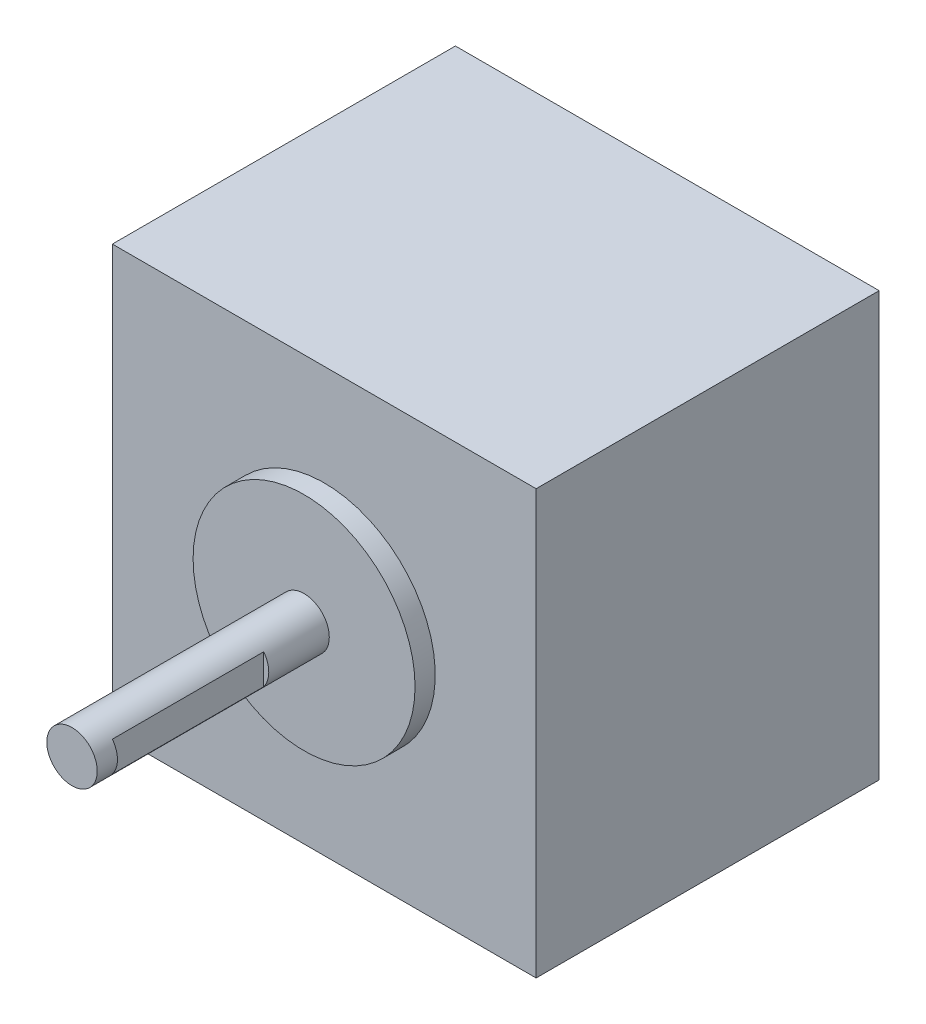
ISO-10303-21;
HEADER;
FILE_DESCRIPTION(('STEP AP214'),'2;1');
FILE_NAME('part.step','',(''),(''),'','','');
FILE_SCHEMA(('AUTOMOTIVE_DESIGN { 1 0 10303 214 1 1 1 1 }'));
ENDSEC;
DATA;
#1=APPLICATION_CONTEXT('core data for automotive mechanical design processes');
#2=APPLICATION_PROTOCOL_DEFINITION('international standard','automotive_design',2000,#1);
#3=PRODUCT_CONTEXT('',#1,'mechanical');
#4=PRODUCT('Part','Part','',(#3));
#5=PRODUCT_RELATED_PRODUCT_CATEGORY('part','',(#4));
#6=PRODUCT_DEFINITION_FORMATION('','',#4);
#7=PRODUCT_DEFINITION_CONTEXT('part definition',#1,'design');
#8=PRODUCT_DEFINITION('design','',#6,#7);
#9=PRODUCT_DEFINITION_SHAPE('','',#8);
#10=(LENGTH_UNIT() NAMED_UNIT(*) SI_UNIT(.MILLI.,.METRE.));
#11=(NAMED_UNIT(*) PLANE_ANGLE_UNIT() SI_UNIT($,.RADIAN.));
#12=(NAMED_UNIT(*) SI_UNIT($,.STERADIAN.) SOLID_ANGLE_UNIT());
#13=UNCERTAINTY_MEASURE_WITH_UNIT(LENGTH_MEASURE(1.E-05),#10,'distance_accuracy_value','');
#14=(GEOMETRIC_REPRESENTATION_CONTEXT(3) GLOBAL_UNCERTAINTY_ASSIGNED_CONTEXT((#13)) GLOBAL_UNIT_ASSIGNED_CONTEXT((#10,
#11,#12)) REPRESENTATION_CONTEXT('',''));
#15=CARTESIAN_POINT('',(0.,0.,0.));
#16=DIRECTION('',(0.,0.,1.));
#17=DIRECTION('',(1.,0.,0.));
#18=AXIS2_PLACEMENT_3D('',#15,#16,#17);
#19=CARTESIAN_POINT('',(21.,-21.,-34.));
#20=DIRECTION('',(1.,0.,0.));
#21=DIRECTION('',(0.,0.,-1.));
#22=AXIS2_PLACEMENT_3D('',#19,#20,#21);
#23=PLANE('',#22);
#24=DIRECTION('',(0.,1.,0.));
#25=VECTOR('',#24,1.);
#26=CARTESIAN_POINT('',(21.,-21.,0.));
#27=LINE('',#26,#25);
#28=CARTESIAN_POINT('',(21.,-21.,0.));
#29=VERTEX_POINT('',#28);
#30=CARTESIAN_POINT('',(21.,21.,0.));
#31=VERTEX_POINT('',#30);
#32=EDGE_CURVE('E140',#29,#31,#27,.T.);
#33=ORIENTED_EDGE('',*,*,#32,.F.);
#34=DIRECTION('',(0.,0.,1.));
#35=VECTOR('',#34,1.);
#36=CARTESIAN_POINT('',(21.,-21.,-34.));
#37=LINE('',#36,#35);
#38=CARTESIAN_POINT('',(21.,-21.,-34.));
#39=VERTEX_POINT('',#38);
#40=EDGE_CURVE('E62',#39,#29,#37,.T.);
#41=ORIENTED_EDGE('',*,*,#40,.F.);
#42=DIRECTION('',(0.,1.,0.));
#43=VECTOR('',#42,1.);
#44=CARTESIAN_POINT('',(21.,-21.,-34.));
#45=LINE('',#44,#43);
#46=CARTESIAN_POINT('',(21.,21.,-34.));
#47=VERTEX_POINT('',#46);
#48=EDGE_CURVE('E132',#39,#47,#45,.T.);
#49=ORIENTED_EDGE('',*,*,#48,.T.);
#50=DIRECTION('',(0.,0.,1.));
#51=VECTOR('',#50,1.);
#52=CARTESIAN_POINT('',(21.,21.,-34.));
#53=LINE('',#52,#51);
#54=EDGE_CURVE('E90',#47,#31,#53,.T.);
#55=ORIENTED_EDGE('',*,*,#54,.T.);
#56=EDGE_LOOP('',(#33,#41,#49,#55));
#57=FACE_BOUND('',#56,.T.);
#58=ADVANCED_FACE('F39',(#57),#23,.T.);
#59=CARTESIAN_POINT('',(-21.,-21.,-34.));
#60=DIRECTION('',(0.,-1.,0.));
#61=DIRECTION('',(0.,0.,-1.));
#62=AXIS2_PLACEMENT_3D('',#59,#60,#61);
#63=PLANE('',#62);
#64=DIRECTION('',(1.,0.,0.));
#65=VECTOR('',#64,1.);
#66=CARTESIAN_POINT('',(-21.,-21.,0.));
#67=LINE('',#66,#65);
#68=CARTESIAN_POINT('',(-21.,-21.,0.));
#69=VERTEX_POINT('',#68);
#70=EDGE_CURVE('E128',#69,#29,#67,.T.);
#71=ORIENTED_EDGE('',*,*,#70,.F.);
#72=DIRECTION('',(0.,0.,1.));
#73=VECTOR('',#72,1.);
#74=CARTESIAN_POINT('',(-21.,-21.,-34.));
#75=LINE('',#74,#73);
#76=CARTESIAN_POINT('',(-21.,-21.,-34.));
#77=VERTEX_POINT('',#76);
#78=EDGE_CURVE('E130',#77,#69,#75,.T.);
#79=ORIENTED_EDGE('',*,*,#78,.F.);
#80=DIRECTION('',(1.,0.,0.));
#81=VECTOR('',#80,1.);
#82=CARTESIAN_POINT('',(-21.,-21.,-34.));
#83=LINE('',#82,#81);
#84=EDGE_CURVE('E123',#77,#39,#83,.T.);
#85=ORIENTED_EDGE('',*,*,#84,.T.);
#86=ORIENTED_EDGE('',*,*,#40,.T.);
#87=EDGE_LOOP('',(#71,#79,#85,#86));
#88=FACE_BOUND('',#87,.T.);
#89=ADVANCED_FACE('F164',(#88),#63,.T.);
#90=CARTESIAN_POINT('',(-21.,-21.,-34.));
#91=DIRECTION('',(-1.,0.,0.));
#92=DIRECTION('',(0.,0.,1.));
#93=AXIS2_PLACEMENT_3D('',#90,#91,#92);
#94=PLANE('',#93);
#95=DIRECTION('',(0.,-1.,0.));
#96=VECTOR('',#95,1.);
#97=CARTESIAN_POINT('',(-21.,-21.,0.));
#98=LINE('',#97,#96);
#99=CARTESIAN_POINT('',(-21.,21.,0.));
#100=VERTEX_POINT('',#99);
#101=EDGE_CURVE('E133',#100,#69,#98,.T.);
#102=ORIENTED_EDGE('',*,*,#101,.F.);
#103=DIRECTION('',(0.,0.,1.));
#104=VECTOR('',#103,1.);
#105=CARTESIAN_POINT('',(-21.,21.,-34.));
#106=LINE('',#105,#104);
#107=CARTESIAN_POINT('',(-21.,21.,-34.));
#108=VERTEX_POINT('',#107);
#109=EDGE_CURVE('E121',#108,#100,#106,.T.);
#110=ORIENTED_EDGE('',*,*,#109,.F.);
#111=DIRECTION('',(0.,-1.,0.));
#112=VECTOR('',#111,1.);
#113=CARTESIAN_POINT('',(-21.,-21.,-34.));
#114=LINE('',#113,#112);
#115=EDGE_CURVE('E144',#108,#77,#114,.T.);
#116=ORIENTED_EDGE('',*,*,#115,.T.);
#117=ORIENTED_EDGE('',*,*,#78,.T.);
#118=EDGE_LOOP('',(#102,#110,#116,#117));
#119=FACE_BOUND('',#118,.T.);
#120=ADVANCED_FACE('F169',(#119),#94,.T.);
#121=CARTESIAN_POINT('',(-21.,21.,-34.));
#122=DIRECTION('',(0.,1.,0.));
#123=DIRECTION('',(0.,0.,1.));
#124=AXIS2_PLACEMENT_3D('',#121,#122,#123);
#125=PLANE('',#124);
#126=DIRECTION('',(-1.,0.,0.));
#127=VECTOR('',#126,1.);
#128=CARTESIAN_POINT('',(-21.,21.,0.));
#129=LINE('',#128,#127);
#130=EDGE_CURVE('E137',#31,#100,#129,.T.);
#131=ORIENTED_EDGE('',*,*,#130,.F.);
#132=ORIENTED_EDGE('',*,*,#54,.F.);
#133=DIRECTION('',(-1.,0.,0.));
#134=VECTOR('',#133,1.);
#135=CARTESIAN_POINT('',(-21.,21.,-34.));
#136=LINE('',#135,#134);
#137=EDGE_CURVE('E150',#47,#108,#136,.T.);
#138=ORIENTED_EDGE('',*,*,#137,.T.);
#139=ORIENTED_EDGE('',*,*,#109,.T.);
#140=EDGE_LOOP('',(#131,#132,#138,#139));
#141=FACE_BOUND('',#140,.T.);
#142=ADVANCED_FACE('F177',(#141),#125,.T.);
#143=CARTESIAN_POINT('',(0.,0.,-34.));
#144=DIRECTION('',(0.,0.,-1.));
#145=DIRECTION('',(-1.,0.,0.));
#146=AXIS2_PLACEMENT_3D('',#143,#144,#145);
#147=PLANE('',#146);
#148=ORIENTED_EDGE('',*,*,#48,.F.);
#149=ORIENTED_EDGE('',*,*,#84,.F.);
#150=ORIENTED_EDGE('',*,*,#115,.F.);
#151=ORIENTED_EDGE('',*,*,#137,.F.);
#152=EDGE_LOOP('',(#148,#149,#150,#151));
#153=FACE_BOUND('',#152,.T.);
#154=ADVANCED_FACE('F178',(#153),#147,.T.);
#155=CARTESIAN_POINT('',(0.,0.,0.));
#156=DIRECTION('',(0.,0.,-1.));
#157=DIRECTION('',(-1.,0.,0.));
#158=AXIS2_PLACEMENT_3D('',#155,#156,#157);
#159=PLANE('',#158);
#160=CARTESIAN_POINT('',(0.,0.,0.));
#161=DIRECTION('',(0.,0.,-1.));
#162=DIRECTION('',(-1.,0.,0.));
#163=AXIS2_PLACEMENT_3D('',#160,#161,#162);
#164=CIRCLE('',#163,11.);
#165=CARTESIAN_POINT('',(-11.,0.,0.));
#166=VERTEX_POINT('',#165);
#167=EDGE_CURVE('E104',#166,#166,#164,.F.);
#168=ORIENTED_EDGE('',*,*,#167,.F.);
#169=EDGE_LOOP('',(#168));
#170=FACE_BOUND('',#169,.T.);
#171=ORIENTED_EDGE('',*,*,#32,.T.);
#172=ORIENTED_EDGE('',*,*,#130,.T.);
#173=ORIENTED_EDGE('',*,*,#101,.T.);
#174=ORIENTED_EDGE('',*,*,#70,.T.);
#175=EDGE_LOOP('',(#171,#172,#173,#174));
#176=FACE_BOUND('',#175,.T.);
#177=ADVANCED_FACE('F175',(#170,#176),#159,.F.);
#178=CARTESIAN_POINT('',(0.,0.,2.));
#179=DIRECTION('',(0.,0.,-1.));
#180=DIRECTION('',(-1.,0.,0.));
#181=AXIS2_PLACEMENT_3D('',#178,#179,#180);
#182=CYLINDRICAL_SURFACE('',#181,11.);
#183=CARTESIAN_POINT('',(0.,0.,2.));
#184=DIRECTION('',(0.,0.,1.));
#185=DIRECTION('',(1.,0.,0.));
#186=AXIS2_PLACEMENT_3D('',#183,#184,#185);
#187=CIRCLE('',#186,11.);
#188=CARTESIAN_POINT('',(11.,0.,2.));
#189=VERTEX_POINT('',#188);
#190=EDGE_CURVE('E125',#189,#189,#187,.T.);
#191=ORIENTED_EDGE('',*,*,#190,.F.);
#192=EDGE_LOOP('',(#191));
#193=FACE_BOUND('',#192,.T.);
#194=ORIENTED_EDGE('',*,*,#167,.T.);
#195=EDGE_LOOP('',(#194));
#196=FACE_BOUND('',#195,.T.);
#197=ADVANCED_FACE('F186',(#193,#196),#182,.T.);
#198=CARTESIAN_POINT('',(0.,0.,2.));
#199=DIRECTION('',(0.,0.,1.));
#200=DIRECTION('',(1.,0.,0.));
#201=AXIS2_PLACEMENT_3D('',#198,#199,#200);
#202=PLANE('',#201);
#203=CARTESIAN_POINT('',(0.,0.,2.));
#204=DIRECTION('',(0.,0.,1.));
#205=DIRECTION('',(1.,0.,0.));
#206=AXIS2_PLACEMENT_3D('',#203,#204,#205);
#207=CIRCLE('',#206,2.5);
#208=CARTESIAN_POINT('',(2.5,0.,2.));
#209=VERTEX_POINT('',#208);
#210=EDGE_CURVE('E117',#209,#209,#207,.T.);
#211=ORIENTED_EDGE('',*,*,#210,.F.);
#212=EDGE_LOOP('',(#211));
#213=FACE_BOUND('',#212,.T.);
#214=ORIENTED_EDGE('',*,*,#190,.T.);
#215=EDGE_LOOP('',(#214));
#216=FACE_BOUND('',#215,.T.);
#217=ADVANCED_FACE('F200',(#213,#216),#202,.T.);
#218=CARTESIAN_POINT('',(0.,0.,25.));
#219=DIRECTION('',(0.,0.,1.));
#220=DIRECTION('',(1.,0.,0.));
#221=AXIS2_PLACEMENT_3D('',#218,#219,#220);
#222=PLANE('',#221);
#223=CARTESIAN_POINT('',(0.,0.,25.));
#224=DIRECTION('',(0.,0.,1.));
#225=DIRECTION('',(1.,0.,0.));
#226=AXIS2_PLACEMENT_3D('',#223,#224,#225);
#227=CIRCLE('',#226,2.5);
#228=CARTESIAN_POINT('',(2.5,0.,25.));
#229=VERTEX_POINT('',#228);
#230=EDGE_CURVE('E122',#229,#229,#227,.T.);
#231=ORIENTED_EDGE('',*,*,#230,.T.);
#232=EDGE_LOOP('',(#231));
#233=FACE_BOUND('',#232,.T.);
#234=ADVANCED_FACE('F191',(#233),#222,.T.);
#235=CARTESIAN_POINT('',(0.,0.,25.));
#236=DIRECTION('',(0.,0.,-1.));
#237=DIRECTION('',(-1.,0.,0.));
#238=AXIS2_PLACEMENT_3D('',#235,#236,#237);
#239=CYLINDRICAL_SURFACE('',#238,2.5);
#240=DIRECTION('',(0.,0.,-1.));
#241=VECTOR('',#240,1.);
#242=CARTESIAN_POINT('',(2.,1.5,25.));
#243=LINE('',#242,#241);
#244=CARTESIAN_POINT('',(2.,1.5,23.));
#245=VERTEX_POINT('',#244);
#246=CARTESIAN_POINT('',(2.,1.5,8.));
#247=VERTEX_POINT('',#246);
#248=EDGE_CURVE('E46',#245,#247,#243,.T.);
#249=ORIENTED_EDGE('',*,*,#248,.T.);
#250=CARTESIAN_POINT('',(0.,0.,8.));
#251=DIRECTION('',(0.,0.,-1.));
#252=DIRECTION('',(-1.,0.,0.));
#253=AXIS2_PLACEMENT_3D('',#250,#251,#252);
#254=CIRCLE('',#253,2.5);
#255=CARTESIAN_POINT('',(2.,-1.5,8.));
#256=VERTEX_POINT('',#255);
#257=EDGE_CURVE('E11',#247,#256,#254,.T.);
#258=ORIENTED_EDGE('',*,*,#257,.T.);
#259=DIRECTION('',(0.,0.,-1.));
#260=VECTOR('',#259,1.);
#261=CARTESIAN_POINT('',(2.,-1.5,25.));
#262=LINE('',#261,#260);
#263=CARTESIAN_POINT('',(2.,-1.5,23.));
#264=VERTEX_POINT('',#263);
#265=EDGE_CURVE('E101',#256,#264,#262,.F.);
#266=ORIENTED_EDGE('',*,*,#265,.T.);
#267=CARTESIAN_POINT('',(0.,0.,23.));
#268=DIRECTION('',(0.,0.,-1.));
#269=DIRECTION('',(-1.,0.,0.));
#270=AXIS2_PLACEMENT_3D('',#267,#268,#269);
#271=CIRCLE('',#270,2.5);
#272=EDGE_CURVE('E96',#245,#264,#271,.T.);
#273=ORIENTED_EDGE('',*,*,#272,.F.);
#274=EDGE_LOOP('',(#249,#258,#266,#273));
#275=FACE_BOUND('',#274,.T.);
#276=ORIENTED_EDGE('',*,*,#210,.T.);
#277=EDGE_LOOP('',(#276));
#278=FACE_BOUND('',#277,.T.);
#279=ORIENTED_EDGE('',*,*,#230,.F.);
#280=EDGE_LOOP('',(#279));
#281=FACE_BOUND('',#280,.T.);
#282=ADVANCED_FACE('F115',(#275,#278,#281),#239,.T.);
#283=CARTESIAN_POINT('',(2.,-3.,8.));
#284=DIRECTION('',(-1.,0.,0.));
#285=DIRECTION('',(0.,0.,1.));
#286=AXIS2_PLACEMENT_3D('',#283,#284,#285);
#287=PLANE('',#286);
#288=DIRECTION('',(0.,-1.,0.));
#289=VECTOR('',#288,1.);
#290=CARTESIAN_POINT('',(2.,-3.,23.));
#291=LINE('',#290,#289);
#292=EDGE_CURVE('E55',#245,#264,#291,.T.);
#293=ORIENTED_EDGE('',*,*,#292,.T.);
#294=ORIENTED_EDGE('',*,*,#265,.F.);
#295=DIRECTION('',(0.,-1.,0.));
#296=VECTOR('',#295,1.);
#297=CARTESIAN_POINT('',(2.,-3.,8.));
#298=LINE('',#297,#296);
#299=EDGE_CURVE('E109',#247,#256,#298,.T.);
#300=ORIENTED_EDGE('',*,*,#299,.F.);
#301=ORIENTED_EDGE('',*,*,#248,.F.);
#302=EDGE_LOOP('',(#293,#294,#300,#301));
#303=FACE_BOUND('',#302,.T.);
#304=ADVANCED_FACE('F110',(#303),#287,.F.);
#305=CARTESIAN_POINT('',(0.,0.,8.));
#306=DIRECTION('',(0.,0.,-1.));
#307=DIRECTION('',(-1.,0.,0.));
#308=AXIS2_PLACEMENT_3D('',#305,#306,#307);
#309=PLANE('',#308);
#310=ORIENTED_EDGE('',*,*,#299,.T.);
#311=ORIENTED_EDGE('',*,*,#257,.F.);
#312=EDGE_LOOP('',(#310,#311));
#313=FACE_BOUND('',#312,.T.);
#314=ADVANCED_FACE('F154',(#313),#309,.F.);
#315=CARTESIAN_POINT('',(0.,0.,23.));
#316=DIRECTION('',(0.,0.,-1.));
#317=DIRECTION('',(-1.,0.,0.));
#318=AXIS2_PLACEMENT_3D('',#315,#316,#317);
#319=PLANE('',#318);
#320=ORIENTED_EDGE('',*,*,#272,.T.);
#321=ORIENTED_EDGE('',*,*,#292,.F.);
#322=EDGE_LOOP('',(#320,#321));
#323=FACE_BOUND('',#322,.T.);
#324=ADVANCED_FACE('F100',(#323),#319,.T.);
#325=CLOSED_SHELL('',(#58,#89,#120,#142,#154,#177,#197,#217,#234,#282,#304,#314,#324));
#326=MANIFOLD_SOLID_BREP('B2',#325);
#327=ADVANCED_BREP_SHAPE_REPRESENTATION('',(#18,#326),#14);
#328=SHAPE_DEFINITION_REPRESENTATION(#9,#327);
ENDSEC;
END-ISO-10303-21;
